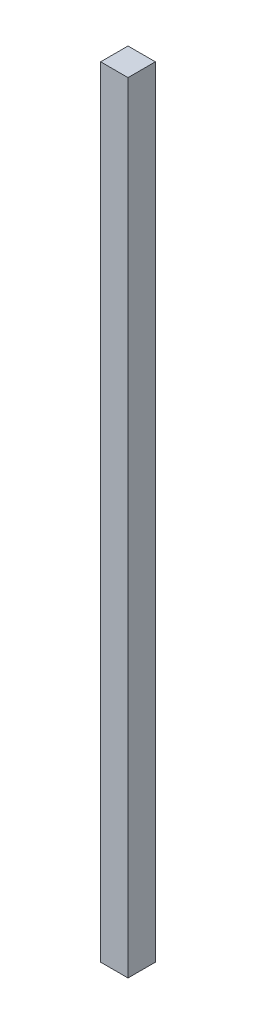
ISO-10303-21;
HEADER;
FILE_DESCRIPTION(('STEP AP214'),'2;1');
FILE_NAME('part.step','',(''),(''),'','','');
FILE_SCHEMA(('AUTOMOTIVE_DESIGN { 1 0 10303 214 1 1 1 1 }'));
ENDSEC;
DATA;
#1=APPLICATION_CONTEXT('core data for automotive mechanical design processes');
#2=APPLICATION_PROTOCOL_DEFINITION('international standard','automotive_design',2000,#1);
#3=PRODUCT_CONTEXT('',#1,'mechanical');
#4=PRODUCT('Part','Part','',(#3));
#5=PRODUCT_RELATED_PRODUCT_CATEGORY('part','',(#4));
#6=PRODUCT_DEFINITION_FORMATION('','',#4);
#7=PRODUCT_DEFINITION_CONTEXT('part definition',#1,'design');
#8=PRODUCT_DEFINITION('design','',#6,#7);
#9=PRODUCT_DEFINITION_SHAPE('','',#8);
#10=(LENGTH_UNIT() NAMED_UNIT(*) SI_UNIT(.MILLI.,.METRE.));
#11=(NAMED_UNIT(*) PLANE_ANGLE_UNIT() SI_UNIT($,.RADIAN.));
#12=(NAMED_UNIT(*) SI_UNIT($,.STERADIAN.) SOLID_ANGLE_UNIT());
#13=UNCERTAINTY_MEASURE_WITH_UNIT(LENGTH_MEASURE(1.E-05),#10,'distance_accuracy_value','');
#14=(GEOMETRIC_REPRESENTATION_CONTEXT(3) GLOBAL_UNCERTAINTY_ASSIGNED_CONTEXT((#13)) GLOBAL_UNIT_ASSIGNED_CONTEXT((#10,
#11,#12)) REPRESENTATION_CONTEXT('',''));
#15=CARTESIAN_POINT('',(0.,0.,0.));
#16=DIRECTION('',(0.,0.,1.));
#17=DIRECTION('',(1.,0.,0.));
#18=AXIS2_PLACEMENT_3D('',#15,#16,#17);
#19=CARTESIAN_POINT('',(-25.,1425.,-25.));
#20=DIRECTION('',(1.,0.,0.));
#21=DIRECTION('',(0.,0.,-1.));
#22=AXIS2_PLACEMENT_3D('',#19,#20,#21);
#23=PLANE('',#22);
#24=DIRECTION('',(0.,0.,1.));
#25=VECTOR('',#24,1.);
#26=CARTESIAN_POINT('',(-25.,0.,-25.));
#27=LINE('',#26,#25);
#28=CARTESIAN_POINT('',(-25.,0.,-25.));
#29=VERTEX_POINT('',#28);
#30=CARTESIAN_POINT('',(-25.,0.,25.));
#31=VERTEX_POINT('',#30);
#32=EDGE_CURVE('E110',#29,#31,#27,.T.);
#33=ORIENTED_EDGE('',*,*,#32,.T.);
#34=DIRECTION('',(0.,-1.,0.));
#35=VECTOR('',#34,1.);
#36=CARTESIAN_POINT('',(-25.,1425.,25.));
#37=LINE('',#36,#35);
#38=CARTESIAN_POINT('',(-25.,1425.,25.));
#39=VERTEX_POINT('',#38);
#40=EDGE_CURVE('E11',#39,#31,#37,.T.);
#41=ORIENTED_EDGE('',*,*,#40,.F.);
#42=DIRECTION('',(0.,0.,1.));
#43=VECTOR('',#42,1.);
#44=CARTESIAN_POINT('',(-25.,1425.,-25.));
#45=LINE('',#44,#43);
#46=CARTESIAN_POINT('',(-25.,1425.,-25.));
#47=VERTEX_POINT('',#46);
#48=EDGE_CURVE('E94',#47,#39,#45,.T.);
#49=ORIENTED_EDGE('',*,*,#48,.F.);
#50=DIRECTION('',(0.,-1.,0.));
#51=VECTOR('',#50,1.);
#52=CARTESIAN_POINT('',(-25.,1425.,-25.));
#53=LINE('',#52,#51);
#54=EDGE_CURVE('E106',#47,#29,#53,.T.);
#55=ORIENTED_EDGE('',*,*,#54,.T.);
#56=EDGE_LOOP('',(#33,#41,#49,#55));
#57=FACE_BOUND('',#56,.T.);
#58=ADVANCED_FACE('F42',(#57),#23,.F.);
#59=CARTESIAN_POINT('',(25.,1425.,25.));
#60=DIRECTION('',(0.,0.,-1.));
#61=DIRECTION('',(-1.,0.,0.));
#62=AXIS2_PLACEMENT_3D('',#59,#60,#61);
#63=PLANE('',#62);
#64=DIRECTION('',(1.,0.,0.));
#65=VECTOR('',#64,1.);
#66=CARTESIAN_POINT('',(25.,0.,25.));
#67=LINE('',#66,#65);
#68=CARTESIAN_POINT('',(25.,0.,25.));
#69=VERTEX_POINT('',#68);
#70=EDGE_CURVE('E99',#31,#69,#67,.T.);
#71=ORIENTED_EDGE('',*,*,#70,.T.);
#72=DIRECTION('',(0.,-1.,0.));
#73=VECTOR('',#72,1.);
#74=CARTESIAN_POINT('',(25.,1425.,25.));
#75=LINE('',#74,#73);
#76=CARTESIAN_POINT('',(25.,1425.,25.));
#77=VERTEX_POINT('',#76);
#78=EDGE_CURVE('E51',#77,#69,#75,.T.);
#79=ORIENTED_EDGE('',*,*,#78,.F.);
#80=DIRECTION('',(1.,0.,0.));
#81=VECTOR('',#80,1.);
#82=CARTESIAN_POINT('',(25.,1425.,25.));
#83=LINE('',#82,#81);
#84=EDGE_CURVE('E89',#39,#77,#83,.T.);
#85=ORIENTED_EDGE('',*,*,#84,.F.);
#86=ORIENTED_EDGE('',*,*,#40,.T.);
#87=EDGE_LOOP('',(#71,#79,#85,#86));
#88=FACE_BOUND('',#87,.T.);
#89=ADVANCED_FACE('F98',(#88),#63,.F.);
#90=CARTESIAN_POINT('',(25.,1425.,-25.));
#91=DIRECTION('',(-1.,0.,0.));
#92=DIRECTION('',(0.,0.,1.));
#93=AXIS2_PLACEMENT_3D('',#90,#91,#92);
#94=PLANE('',#93);
#95=DIRECTION('',(0.,0.,-1.));
#96=VECTOR('',#95,1.);
#97=CARTESIAN_POINT('',(25.,0.,-25.));
#98=LINE('',#97,#96);
#99=CARTESIAN_POINT('',(25.,0.,-25.));
#100=VERTEX_POINT('',#99);
#101=EDGE_CURVE('E76',#69,#100,#98,.T.);
#102=ORIENTED_EDGE('',*,*,#101,.T.);
#103=DIRECTION('',(0.,-1.,0.));
#104=VECTOR('',#103,1.);
#105=CARTESIAN_POINT('',(25.,1425.,-25.));
#106=LINE('',#105,#104);
#107=CARTESIAN_POINT('',(25.,1425.,-25.));
#108=VERTEX_POINT('',#107);
#109=EDGE_CURVE('E101',#108,#100,#106,.T.);
#110=ORIENTED_EDGE('',*,*,#109,.F.);
#111=DIRECTION('',(0.,0.,-1.));
#112=VECTOR('',#111,1.);
#113=CARTESIAN_POINT('',(25.,1425.,-25.));
#114=LINE('',#113,#112);
#115=EDGE_CURVE('E92',#77,#108,#114,.T.);
#116=ORIENTED_EDGE('',*,*,#115,.F.);
#117=ORIENTED_EDGE('',*,*,#78,.T.);
#118=EDGE_LOOP('',(#102,#110,#116,#117));
#119=FACE_BOUND('',#118,.T.);
#120=ADVANCED_FACE('F102',(#119),#94,.F.);
#121=CARTESIAN_POINT('',(25.,1425.,-25.));
#122=DIRECTION('',(0.,0.,1.));
#123=DIRECTION('',(1.,0.,0.));
#124=AXIS2_PLACEMENT_3D('',#121,#122,#123);
#125=PLANE('',#124);
#126=DIRECTION('',(-1.,0.,0.));
#127=VECTOR('',#126,1.);
#128=CARTESIAN_POINT('',(25.,0.,-25.));
#129=LINE('',#128,#127);
#130=EDGE_CURVE('E82',#100,#29,#129,.T.);
#131=ORIENTED_EDGE('',*,*,#130,.T.);
#132=ORIENTED_EDGE('',*,*,#54,.F.);
#133=DIRECTION('',(-1.,0.,0.));
#134=VECTOR('',#133,1.);
#135=CARTESIAN_POINT('',(25.,1425.,-25.));
#136=LINE('',#135,#134);
#137=EDGE_CURVE('E59',#108,#47,#136,.T.);
#138=ORIENTED_EDGE('',*,*,#137,.F.);
#139=ORIENTED_EDGE('',*,*,#109,.T.);
#140=EDGE_LOOP('',(#131,#132,#138,#139));
#141=FACE_BOUND('',#140,.T.);
#142=ADVANCED_FACE('F124',(#141),#125,.F.);
#143=CARTESIAN_POINT('',(0.,1425.,0.));
#144=DIRECTION('',(0.,-1.,0.));
#145=DIRECTION('',(0.,0.,-1.));
#146=AXIS2_PLACEMENT_3D('',#143,#144,#145);
#147=PLANE('',#146);
#148=ORIENTED_EDGE('',*,*,#48,.T.);
#149=ORIENTED_EDGE('',*,*,#84,.T.);
#150=ORIENTED_EDGE('',*,*,#115,.T.);
#151=ORIENTED_EDGE('',*,*,#137,.T.);
#152=EDGE_LOOP('',(#148,#149,#150,#151));
#153=FACE_BOUND('',#152,.T.);
#154=ADVANCED_FACE('F90',(#153),#147,.F.);
#155=CARTESIAN_POINT('',(0.,0.,0.));
#156=DIRECTION('',(0.,-1.,0.));
#157=DIRECTION('',(0.,0.,-1.));
#158=AXIS2_PLACEMENT_3D('',#155,#156,#157);
#159=PLANE('',#158);
#160=CARTESIAN_POINT('',(0.,0.,0.));
#161=DIRECTION('',(0.,-1.,0.));
#162=DIRECTION('',(0.,0.,-1.));
#163=AXIS2_PLACEMENT_3D('',#160,#161,#162);
#164=CIRCLE('',#163,5.);
#165=CARTESIAN_POINT('',(0.,0.,-5.));
#166=VERTEX_POINT('',#165);
#167=EDGE_CURVE('E131',#166,#166,#164,.T.);
#168=ORIENTED_EDGE('',*,*,#167,.F.);
#169=EDGE_LOOP('',(#168));
#170=FACE_BOUND('',#169,.T.);
#171=ORIENTED_EDGE('',*,*,#32,.F.);
#172=ORIENTED_EDGE('',*,*,#130,.F.);
#173=ORIENTED_EDGE('',*,*,#101,.F.);
#174=ORIENTED_EDGE('',*,*,#70,.F.);
#175=EDGE_LOOP('',(#171,#172,#173,#174));
#176=FACE_BOUND('',#175,.T.);
#177=ADVANCED_FACE('F127',(#170,#176),#159,.T.);
#178=CARTESIAN_POINT('',(0.,50.,0.));
#179=DIRECTION('',(0.,-1.,0.));
#180=DIRECTION('',(0.,0.,-1.));
#181=AXIS2_PLACEMENT_3D('',#178,#179,#180);
#182=CYLINDRICAL_SURFACE('',#181,5.);
#183=CARTESIAN_POINT('',(0.,50.,0.));
#184=DIRECTION('',(0.,-1.,0.));
#185=DIRECTION('',(0.,0.,-1.));
#186=AXIS2_PLACEMENT_3D('',#183,#184,#185);
#187=CIRCLE('',#186,5.);
#188=CARTESIAN_POINT('',(0.,50.,-5.));
#189=VERTEX_POINT('',#188);
#190=EDGE_CURVE('E114',#189,#189,#187,.T.);
#191=ORIENTED_EDGE('',*,*,#190,.F.);
#192=EDGE_LOOP('',(#191));
#193=FACE_BOUND('',#192,.T.);
#194=ORIENTED_EDGE('',*,*,#167,.T.);
#195=EDGE_LOOP('',(#194));
#196=FACE_BOUND('',#195,.T.);
#197=ADVANCED_FACE('F141',(#193,#196),#182,.F.);
#198=CARTESIAN_POINT('',(0.,50.,0.));
#199=DIRECTION('',(0.,-1.,0.));
#200=DIRECTION('',(0.,0.,-1.));
#201=AXIS2_PLACEMENT_3D('',#198,#199,#200);
#202=PLANE('',#201);
#203=ORIENTED_EDGE('',*,*,#190,.T.);
#204=EDGE_LOOP('',(#203));
#205=FACE_BOUND('',#204,.T.);
#206=ADVANCED_FACE('F139',(#205),#202,.T.);
#207=CLOSED_SHELL('',(#58,#89,#120,#142,#154,#177,#197,#206));
#208=MANIFOLD_SOLID_BREP('B2',#207);
#209=ADVANCED_BREP_SHAPE_REPRESENTATION('',(#18,#208),#14);
#210=SHAPE_DEFINITION_REPRESENTATION(#9,#209);
ENDSEC;
END-ISO-10303-21;
